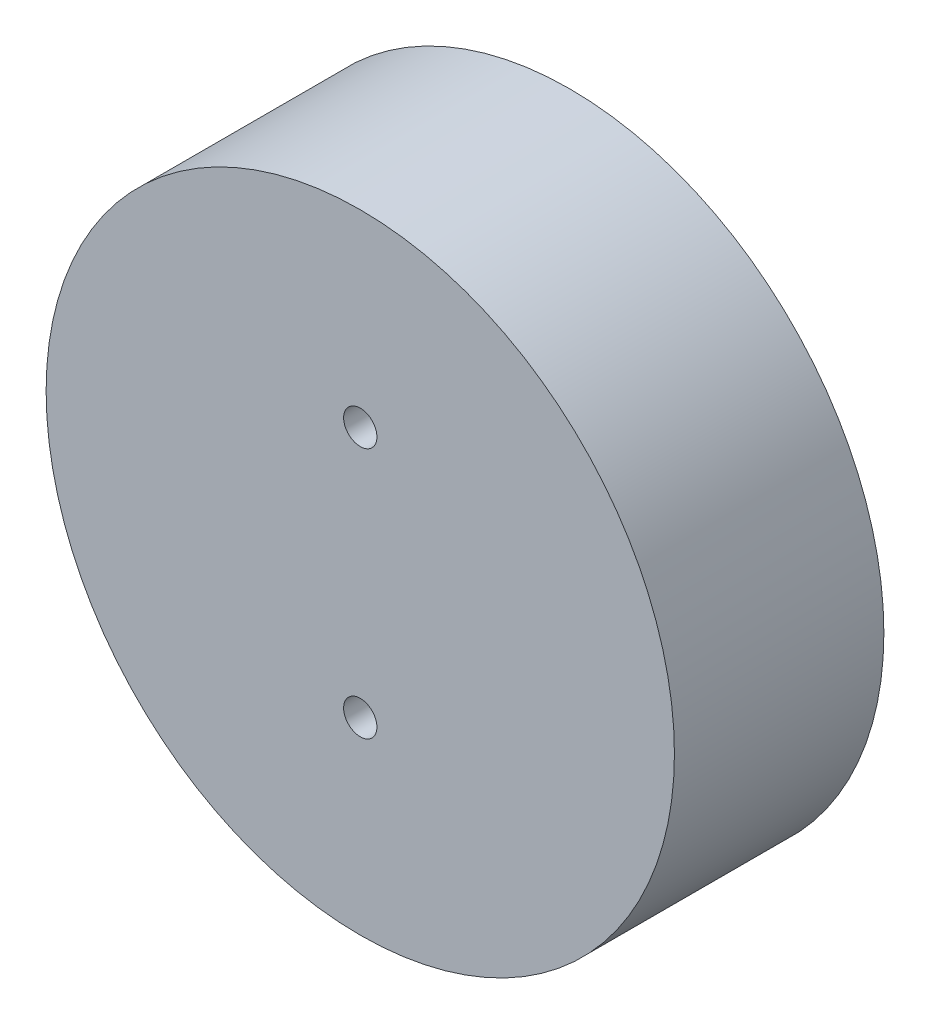
ISO-10303-21;
HEADER;
FILE_DESCRIPTION(('STEP AP214'),'2;1');
FILE_NAME('part.step','',(''),(''),'','','');
FILE_SCHEMA(('AUTOMOTIVE_DESIGN { 1 0 10303 214 1 1 1 1 }'));
ENDSEC;
DATA;
#1=APPLICATION_CONTEXT('core data for automotive mechanical design processes');
#2=APPLICATION_PROTOCOL_DEFINITION('international standard','automotive_design',2000,#1);
#3=PRODUCT_CONTEXT('',#1,'mechanical');
#4=PRODUCT('Part','Part','',(#3));
#5=PRODUCT_RELATED_PRODUCT_CATEGORY('part','',(#4));
#6=PRODUCT_DEFINITION_FORMATION('','',#4);
#7=PRODUCT_DEFINITION_CONTEXT('part definition',#1,'design');
#8=PRODUCT_DEFINITION('design','',#6,#7);
#9=PRODUCT_DEFINITION_SHAPE('','',#8);
#10=(LENGTH_UNIT() NAMED_UNIT(*) SI_UNIT(.MILLI.,.METRE.));
#11=(NAMED_UNIT(*) PLANE_ANGLE_UNIT() SI_UNIT($,.RADIAN.));
#12=(NAMED_UNIT(*) SI_UNIT($,.STERADIAN.) SOLID_ANGLE_UNIT());
#13=UNCERTAINTY_MEASURE_WITH_UNIT(LENGTH_MEASURE(1.E-05),#10,'distance_accuracy_value','');
#14=(GEOMETRIC_REPRESENTATION_CONTEXT(3) GLOBAL_UNCERTAINTY_ASSIGNED_CONTEXT((#13)) GLOBAL_UNIT_ASSIGNED_CONTEXT((#10,
#11,#12)) REPRESENTATION_CONTEXT('',''));
#15=CARTESIAN_POINT('',(0.,0.,0.));
#16=DIRECTION('',(0.,0.,1.));
#17=DIRECTION('',(1.,0.,0.));
#18=AXIS2_PLACEMENT_3D('',#15,#16,#17);
#19=CARTESIAN_POINT('',(0.,38.1,0.));
#20=DIRECTION('',(0.,0.,-1.));
#21=DIRECTION('',(0.,1.,0.));
#22=AXIS2_PLACEMENT_3D('',#19,#20,#21);
#23=PLANE('',#22);
#24=CARTESIAN_POINT('',(0.,15.24,0.));
#25=DIRECTION('',(0.,0.,-1.));
#26=DIRECTION('',(-1.,0.,0.));
#27=AXIS2_PLACEMENT_3D('',#24,#25,#26);
#28=CIRCLE('',#27,2.01929999999999);
#29=CARTESIAN_POINT('',(-2.01929999999999,15.24,0.));
#30=VERTEX_POINT('',#29);
#31=EDGE_CURVE('E98',#30,#30,#28,.T.);
#32=ORIENTED_EDGE('',*,*,#31,.T.);
#33=EDGE_LOOP('',(#32));
#34=FACE_BOUND('',#33,.T.);
#35=CARTESIAN_POINT('',(0.,-15.24,0.));
#36=DIRECTION('',(0.,0.,-1.));
#37=DIRECTION('',(-1.,0.,0.));
#38=AXIS2_PLACEMENT_3D('',#35,#36,#37);
#39=CIRCLE('',#38,2.01929999999999);
#40=CARTESIAN_POINT('',(-2.01929999999999,-15.24,0.));
#41=VERTEX_POINT('',#40);
#42=EDGE_CURVE('E86',#41,#41,#39,.T.);
#43=ORIENTED_EDGE('',*,*,#42,.T.);
#44=EDGE_LOOP('',(#43));
#45=FACE_BOUND('',#44,.T.);
#46=CARTESIAN_POINT('',(0.,0.,0.));
#47=DIRECTION('',(0.,0.,1.));
#48=DIRECTION('',(0.,-1.,0.));
#49=AXIS2_PLACEMENT_3D('',#46,#47,#48);
#50=CIRCLE('',#49,38.1);
#51=CARTESIAN_POINT('',(0.,-38.1,0.));
#52=VERTEX_POINT('',#51);
#53=EDGE_CURVE('E11',#52,#52,#50,.T.);
#54=ORIENTED_EDGE('',*,*,#53,.T.);
#55=EDGE_LOOP('',(#54));
#56=FACE_BOUND('',#55,.T.);
#57=ADVANCED_FACE('F46',(#34,#45,#56),#23,.F.);
#58=CARTESIAN_POINT('',(0.,0.,0.));
#59=DIRECTION('',(0.,0.,1.));
#60=DIRECTION('',(0.,-1.,0.));
#61=AXIS2_PLACEMENT_3D('',#58,#59,#60);
#62=CYLINDRICAL_SURFACE('',#61,38.1);
#63=ORIENTED_EDGE('',*,*,#53,.F.);
#64=EDGE_LOOP('',(#63));
#65=FACE_BOUND('',#64,.T.);
#66=CARTESIAN_POINT('',(0.,0.,-25.4));
#67=DIRECTION('',(0.,0.,1.));
#68=DIRECTION('',(0.,-1.,0.));
#69=AXIS2_PLACEMENT_3D('',#66,#67,#68);
#70=CIRCLE('',#69,38.1);
#71=CARTESIAN_POINT('',(0.,-38.1,-25.4));
#72=VERTEX_POINT('',#71);
#73=EDGE_CURVE('E54',#72,#72,#70,.T.);
#74=ORIENTED_EDGE('',*,*,#73,.T.);
#75=EDGE_LOOP('',(#74));
#76=FACE_BOUND('',#75,.T.);
#77=ADVANCED_FACE('F173',(#65,#76),#62,.T.);
#78=CARTESIAN_POINT('',(0.,38.1,-25.4));
#79=DIRECTION('',(0.,0.,1.));
#80=DIRECTION('',(0.,-1.,0.));
#81=AXIS2_PLACEMENT_3D('',#78,#79,#80);
#82=PLANE('',#81);
#83=ORIENTED_EDGE('',*,*,#73,.F.);
#84=EDGE_LOOP('',(#83));
#85=FACE_BOUND('',#84,.T.);
#86=CARTESIAN_POINT('',(0.,0.,-25.4));
#87=DIRECTION('',(0.,0.,1.));
#88=DIRECTION('',(0.,-1.,0.));
#89=AXIS2_PLACEMENT_3D('',#86,#87,#88);
#90=CIRCLE('',#89,30.48);
#91=CARTESIAN_POINT('',(0.,-30.48,-25.4));
#92=VERTEX_POINT('',#91);
#93=EDGE_CURVE('E62',#92,#92,#90,.T.);
#94=ORIENTED_EDGE('',*,*,#93,.T.);
#95=EDGE_LOOP('',(#94));
#96=FACE_BOUND('',#95,.T.);
#97=ADVANCED_FACE('F132',(#85,#96),#82,.F.);
#98=CARTESIAN_POINT('',(0.,0.,0.));
#99=DIRECTION('',(0.,0.,1.));
#100=DIRECTION('',(0.,-1.,0.));
#101=AXIS2_PLACEMENT_3D('',#98,#99,#100);
#102=CYLINDRICAL_SURFACE('',#101,30.48);
#103=ORIENTED_EDGE('',*,*,#93,.F.);
#104=EDGE_LOOP('',(#103));
#105=FACE_BOUND('',#104,.T.);
#106=CARTESIAN_POINT('',(0.,0.,-28.194));
#107=DIRECTION('',(0.,0.,1.));
#108=DIRECTION('',(0.,-1.,0.));
#109=AXIS2_PLACEMENT_3D('',#106,#107,#108);
#110=CIRCLE('',#109,30.48);
#111=CARTESIAN_POINT('',(0.,-30.48,-28.194));
#112=VERTEX_POINT('',#111);
#113=EDGE_CURVE('E69',#112,#112,#110,.T.);
#114=ORIENTED_EDGE('',*,*,#113,.T.);
#115=EDGE_LOOP('',(#114));
#116=FACE_BOUND('',#115,.T.);
#117=ADVANCED_FACE('F116',(#105,#116),#102,.T.);
#118=CARTESIAN_POINT('',(0.,30.48,-28.194));
#119=DIRECTION('',(0.,0.,1.));
#120=DIRECTION('',(0.,-1.,0.));
#121=AXIS2_PLACEMENT_3D('',#118,#119,#120);
#122=PLANE('',#121);
#123=CARTESIAN_POINT('',(0.,15.24,-28.194));
#124=DIRECTION('',(0.,0.,-1.));
#125=DIRECTION('',(-1.,0.,0.));
#126=AXIS2_PLACEMENT_3D('',#123,#124,#125);
#127=CIRCLE('',#126,2.01929999999999);
#128=CARTESIAN_POINT('',(-2.01929999999999,15.24,-28.194));
#129=VERTEX_POINT('',#128);
#130=EDGE_CURVE('E93',#129,#129,#127,.T.);
#131=ORIENTED_EDGE('',*,*,#130,.F.);
#132=EDGE_LOOP('',(#131));
#133=FACE_BOUND('',#132,.T.);
#134=CARTESIAN_POINT('',(0.,-15.24,-28.194));
#135=DIRECTION('',(0.,0.,-1.));
#136=DIRECTION('',(-1.,0.,0.));
#137=AXIS2_PLACEMENT_3D('',#134,#135,#136);
#138=CIRCLE('',#137,2.01929999999999);
#139=CARTESIAN_POINT('',(-2.01929999999999,-15.24,-28.194));
#140=VERTEX_POINT('',#139);
#141=EDGE_CURVE('E81',#140,#140,#138,.T.);
#142=ORIENTED_EDGE('',*,*,#141,.F.);
#143=EDGE_LOOP('',(#142));
#144=FACE_BOUND('',#143,.T.);
#145=ORIENTED_EDGE('',*,*,#113,.F.);
#146=EDGE_LOOP('',(#145));
#147=FACE_BOUND('',#146,.T.);
#148=ADVANCED_FACE('F113',(#133,#144,#147),#122,.F.);
#149=CARTESIAN_POINT('',(0.,-15.24,-28.194));
#150=DIRECTION('',(0.,0.,-1.));
#151=DIRECTION('',(-1.,0.,0.));
#152=AXIS2_PLACEMENT_3D('',#149,#150,#151);
#153=CYLINDRICAL_SURFACE('',#152,2.01929999999999);
#154=ORIENTED_EDGE('',*,*,#42,.F.);
#155=EDGE_LOOP('',(#154));
#156=FACE_BOUND('',#155,.T.);
#157=ORIENTED_EDGE('',*,*,#141,.T.);
#158=EDGE_LOOP('',(#157));
#159=FACE_BOUND('',#158,.T.);
#160=ADVANCED_FACE('F109',(#156,#159),#153,.F.);
#161=CARTESIAN_POINT('',(0.,15.24,-28.194));
#162=DIRECTION('',(0.,0.,-1.));
#163=DIRECTION('',(-1.,0.,0.));
#164=AXIS2_PLACEMENT_3D('',#161,#162,#163);
#165=CYLINDRICAL_SURFACE('',#164,2.01929999999999);
#166=ORIENTED_EDGE('',*,*,#31,.F.);
#167=EDGE_LOOP('',(#166));
#168=FACE_BOUND('',#167,.T.);
#169=ORIENTED_EDGE('',*,*,#130,.T.);
#170=EDGE_LOOP('',(#169));
#171=FACE_BOUND('',#170,.T.);
#172=ADVANCED_FACE('F106',(#168,#171),#165,.F.);
#173=CLOSED_SHELL('',(#57,#77,#97,#117,#148,#160,#172));
#174=MANIFOLD_SOLID_BREP('B2',#173);
#175=ADVANCED_BREP_SHAPE_REPRESENTATION('',(#18,#174),#14);
#176=SHAPE_DEFINITION_REPRESENTATION(#9,#175);
ENDSEC;
END-ISO-10303-21;
